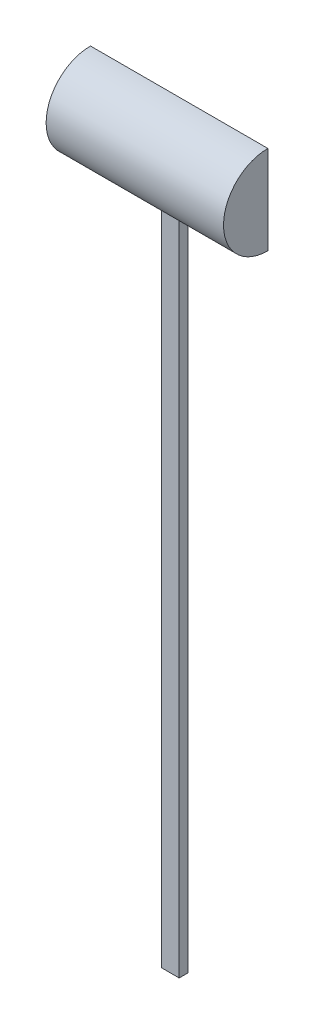
ISO-10303-21;
HEADER;
FILE_DESCRIPTION(('STEP AP214'),'2;1');
FILE_NAME('part.step','',(''),(''),'','','');
FILE_SCHEMA(('AUTOMOTIVE_DESIGN { 1 0 10303 214 1 1 1 1 }'));
ENDSEC;
DATA;
#1=APPLICATION_CONTEXT('core data for automotive mechanical design processes');
#2=APPLICATION_PROTOCOL_DEFINITION('international standard','automotive_design',2000,#1);
#3=PRODUCT_CONTEXT('',#1,'mechanical');
#4=PRODUCT('Part','Part','',(#3));
#5=PRODUCT_RELATED_PRODUCT_CATEGORY('part','',(#4));
#6=PRODUCT_DEFINITION_FORMATION('','',#4);
#7=PRODUCT_DEFINITION_CONTEXT('part definition',#1,'design');
#8=PRODUCT_DEFINITION('design','',#6,#7);
#9=PRODUCT_DEFINITION_SHAPE('','',#8);
#10=(LENGTH_UNIT() NAMED_UNIT(*) SI_UNIT(.MILLI.,.METRE.));
#11=(NAMED_UNIT(*) PLANE_ANGLE_UNIT() SI_UNIT($,.RADIAN.));
#12=(NAMED_UNIT(*) SI_UNIT($,.STERADIAN.) SOLID_ANGLE_UNIT());
#13=UNCERTAINTY_MEASURE_WITH_UNIT(LENGTH_MEASURE(1.E-05),#10,'distance_accuracy_value','');
#14=(GEOMETRIC_REPRESENTATION_CONTEXT(3) GLOBAL_UNCERTAINTY_ASSIGNED_CONTEXT((#13)) GLOBAL_UNIT_ASSIGNED_CONTEXT((#10,
#11,#12)) REPRESENTATION_CONTEXT('',''));
#15=CARTESIAN_POINT('',(0.,0.,0.));
#16=DIRECTION('',(0.,0.,1.));
#17=DIRECTION('',(1.,0.,0.));
#18=AXIS2_PLACEMENT_3D('',#15,#16,#17);
#19=CARTESIAN_POINT('',(0.,0.,0.));
#20=DIRECTION('',(0.,0.,1.));
#21=DIRECTION('',(1.,0.,0.));
#22=AXIS2_PLACEMENT_3D('',#19,#20,#21);
#23=PLANE('',#22);
#24=DIRECTION('',(0.,-1.,0.));
#25=VECTOR('',#24,1.);
#26=CARTESIAN_POINT('',(10.,0.,0.));
#27=LINE('',#26,#25);
#28=CARTESIAN_POINT('',(10.,5.,0.));
#29=VERTEX_POINT('',#28);
#30=CARTESIAN_POINT('',(10.,-5.,0.));
#31=VERTEX_POINT('',#30);
#32=EDGE_CURVE('E11',#29,#31,#27,.T.);
#33=ORIENTED_EDGE('',*,*,#32,.T.);
#34=DIRECTION('',(-1.,0.,0.));
#35=VECTOR('',#34,1.);
#36=CARTESIAN_POINT('',(10.,-5.,0.));
#37=LINE('',#36,#35);
#38=CARTESIAN_POINT('',(1.,-5.,0.));
#39=VERTEX_POINT('',#38);
#40=EDGE_CURVE('E52',#39,#31,#37,.F.);
#41=ORIENTED_EDGE('',*,*,#40,.F.);
#42=DIRECTION('',(0.,1.,0.));
#43=VECTOR('',#42,1.);
#44=CARTESIAN_POINT('',(1.,0.,0.));
#45=LINE('',#44,#43);
#46=CARTESIAN_POINT('',(1.00000000000002,-80.,0.));
#47=VERTEX_POINT('',#46);
#48=EDGE_CURVE('E124',#47,#39,#45,.T.);
#49=ORIENTED_EDGE('',*,*,#48,.F.);
#50=DIRECTION('',(1.,0.,0.));
#51=VECTOR('',#50,1.);
#52=CARTESIAN_POINT('',(-0.99999999999999,-80.,0.));
#53=LINE('',#52,#51);
#54=CARTESIAN_POINT('',(-0.99999999999999,-80.,0.));
#55=VERTEX_POINT('',#54);
#56=EDGE_CURVE('E126',#55,#47,#53,.T.);
#57=ORIENTED_EDGE('',*,*,#56,.F.);
#58=DIRECTION('',(0.,-1.,0.));
#59=VECTOR('',#58,1.);
#60=CARTESIAN_POINT('',(-1.,0.,0.));
#61=LINE('',#60,#59);
#62=CARTESIAN_POINT('',(-0.999999999999999,-5.,0.));
#63=VERTEX_POINT('',#62);
#64=EDGE_CURVE('E107',#63,#55,#61,.T.);
#65=ORIENTED_EDGE('',*,*,#64,.F.);
#66=CARTESIAN_POINT('',(-10.,-5.,0.));
#67=VERTEX_POINT('',#66);
#68=EDGE_CURVE('E130',#67,#63,#37,.F.);
#69=ORIENTED_EDGE('',*,*,#68,.F.);
#70=DIRECTION('',(0.,-1.,0.));
#71=VECTOR('',#70,1.);
#72=CARTESIAN_POINT('',(-10.,0.,0.));
#73=LINE('',#72,#71);
#74=CARTESIAN_POINT('',(-10.,5.,0.));
#75=VERTEX_POINT('',#74);
#76=EDGE_CURVE('E129',#75,#67,#73,.T.);
#77=ORIENTED_EDGE('',*,*,#76,.F.);
#78=DIRECTION('',(-1.,0.,0.));
#79=VECTOR('',#78,1.);
#80=CARTESIAN_POINT('',(10.,5.,0.));
#81=LINE('',#80,#79);
#82=EDGE_CURVE('E35',#29,#75,#81,.T.);
#83=ORIENTED_EDGE('',*,*,#82,.F.);
#84=EDGE_LOOP('',(#33,#41,#49,#57,#65,#69,#77,#83));
#85=FACE_BOUND('',#84,.T.);
#86=ADVANCED_FACE('F32',(#85),#23,.F.);
#87=CARTESIAN_POINT('',(-1.,0.,1.));
#88=DIRECTION('',(1.,0.,0.));
#89=DIRECTION('',(0.,1.,0.));
#90=AXIS2_PLACEMENT_3D('',#87,#88,#89);
#91=PLANE('',#90);
#92=CARTESIAN_POINT('',(-0.999999999999999,0.,0.));
#93=DIRECTION('',(1.,0.,0.));
#94=DIRECTION('',(0.,1.,0.));
#95=AXIS2_PLACEMENT_3D('',#92,#93,#94);
#96=CIRCLE('',#95,5.);
#97=CARTESIAN_POINT('',(-0.999999999999999,-4.89897948556635,1.));
#98=VERTEX_POINT('',#97);
#99=EDGE_CURVE('E121',#98,#63,#96,.T.);
#100=ORIENTED_EDGE('',*,*,#99,.T.);
#101=ORIENTED_EDGE('',*,*,#64,.T.);
#102=DIRECTION('',(0.,0.,-1.));
#103=VECTOR('',#102,1.);
#104=CARTESIAN_POINT('',(-0.99999999999999,-80.,1.));
#105=LINE('',#104,#103);
#106=CARTESIAN_POINT('',(-0.99999999999999,-80.,1.));
#107=VERTEX_POINT('',#106);
#108=EDGE_CURVE('E99',#107,#55,#105,.T.);
#109=ORIENTED_EDGE('',*,*,#108,.F.);
#110=DIRECTION('',(0.,-1.,0.));
#111=VECTOR('',#110,1.);
#112=CARTESIAN_POINT('',(-1.,0.,1.));
#113=LINE('',#112,#111);
#114=EDGE_CURVE('E84',#98,#107,#113,.T.);
#115=ORIENTED_EDGE('',*,*,#114,.F.);
#116=EDGE_LOOP('',(#100,#101,#109,#115));
#117=FACE_BOUND('',#116,.T.);
#118=ADVANCED_FACE('F105',(#117),#91,.F.);
#119=CARTESIAN_POINT('',(0.,0.,1.));
#120=DIRECTION('',(0.,0.,1.));
#121=DIRECTION('',(1.,0.,0.));
#122=AXIS2_PLACEMENT_3D('',#119,#120,#121);
#123=PLANE('',#122);
#124=DIRECTION('',(-1.,0.,0.));
#125=VECTOR('',#124,1.);
#126=CARTESIAN_POINT('',(10.,-4.89897948556635,1.));
#127=LINE('',#126,#125);
#128=CARTESIAN_POINT('',(1.,-4.89897948556635,1.));
#129=VERTEX_POINT('',#128);
#130=EDGE_CURVE('E91',#98,#129,#127,.F.);
#131=ORIENTED_EDGE('',*,*,#130,.F.);
#132=ORIENTED_EDGE('',*,*,#114,.T.);
#133=DIRECTION('',(1.,0.,0.));
#134=VECTOR('',#133,1.);
#135=CARTESIAN_POINT('',(-0.99999999999999,-80.,1.));
#136=LINE('',#135,#134);
#137=CARTESIAN_POINT('',(1.00000000000002,-80.,1.));
#138=VERTEX_POINT('',#137);
#139=EDGE_CURVE('E88',#107,#138,#136,.T.);
#140=ORIENTED_EDGE('',*,*,#139,.T.);
#141=DIRECTION('',(0.,1.,0.));
#142=VECTOR('',#141,1.);
#143=CARTESIAN_POINT('',(1.,0.,1.));
#144=LINE('',#143,#142);
#145=EDGE_CURVE('E103',#138,#129,#144,.T.);
#146=ORIENTED_EDGE('',*,*,#145,.T.);
#147=EDGE_LOOP('',(#131,#132,#140,#146));
#148=FACE_BOUND('',#147,.T.);
#149=ADVANCED_FACE('F86',(#148),#123,.T.);
#150=CARTESIAN_POINT('',(10.,0.,0.));
#151=DIRECTION('',(-1.,0.,0.));
#152=DIRECTION('',(0.,0.,1.));
#153=AXIS2_PLACEMENT_3D('',#150,#151,#152);
#154=CYLINDRICAL_SURFACE('',#153,5.);
#155=CARTESIAN_POINT('',(10.,0.,0.));
#156=DIRECTION('',(1.,0.,0.));
#157=DIRECTION('',(0.,0.,-1.));
#158=AXIS2_PLACEMENT_3D('',#155,#156,#157);
#159=CIRCLE('',#158,5.);
#160=EDGE_CURVE('E112',#29,#31,#159,.T.);
#161=ORIENTED_EDGE('',*,*,#160,.F.);
#162=ORIENTED_EDGE('',*,*,#82,.T.);
#163=CARTESIAN_POINT('',(-10.,0.,0.));
#164=DIRECTION('',(1.,0.,0.));
#165=DIRECTION('',(0.,0.,-1.));
#166=AXIS2_PLACEMENT_3D('',#163,#164,#165);
#167=CIRCLE('',#166,5.);
#168=EDGE_CURVE('E109',#75,#67,#167,.T.);
#169=ORIENTED_EDGE('',*,*,#168,.T.);
#170=ORIENTED_EDGE('',*,*,#68,.T.);
#171=ORIENTED_EDGE('',*,*,#99,.F.);
#172=ORIENTED_EDGE('',*,*,#130,.T.);
#173=CARTESIAN_POINT('',(0.999999999999999,0.,0.));
#174=DIRECTION('',(-1.,0.,0.));
#175=DIRECTION('',(0.,-1.,0.));
#176=AXIS2_PLACEMENT_3D('',#173,#174,#175);
#177=CIRCLE('',#176,5.);
#178=EDGE_CURVE('E118',#39,#129,#177,.T.);
#179=ORIENTED_EDGE('',*,*,#178,.F.);
#180=ORIENTED_EDGE('',*,*,#40,.T.);
#181=EDGE_LOOP('',(#161,#162,#169,#170,#171,#172,#179,#180));
#182=FACE_BOUND('',#181,.T.);
#183=ADVANCED_FACE('F136',(#182),#154,.T.);
#184=CARTESIAN_POINT('',(-0.99999999999999,-80.,1.));
#185=DIRECTION('',(0.,1.,0.));
#186=DIRECTION('',(0.,0.,1.));
#187=AXIS2_PLACEMENT_3D('',#184,#185,#186);
#188=PLANE('',#187);
#189=ORIENTED_EDGE('',*,*,#108,.T.);
#190=ORIENTED_EDGE('',*,*,#56,.T.);
#191=DIRECTION('',(0.,0.,-1.));
#192=VECTOR('',#191,1.);
#193=CARTESIAN_POINT('',(1.00000000000002,-80.,1.));
#194=LINE('',#193,#192);
#195=EDGE_CURVE('E101',#138,#47,#194,.T.);
#196=ORIENTED_EDGE('',*,*,#195,.F.);
#197=ORIENTED_EDGE('',*,*,#139,.F.);
#198=EDGE_LOOP('',(#189,#190,#196,#197));
#199=FACE_BOUND('',#198,.T.);
#200=ADVANCED_FACE('F98',(#199),#188,.F.);
#201=CARTESIAN_POINT('',(1.,0.,1.));
#202=DIRECTION('',(-1.,0.,0.));
#203=DIRECTION('',(0.,-1.,0.));
#204=AXIS2_PLACEMENT_3D('',#201,#202,#203);
#205=PLANE('',#204);
#206=ORIENTED_EDGE('',*,*,#195,.T.);
#207=ORIENTED_EDGE('',*,*,#48,.T.);
#208=ORIENTED_EDGE('',*,*,#178,.T.);
#209=ORIENTED_EDGE('',*,*,#145,.F.);
#210=EDGE_LOOP('',(#206,#207,#208,#209));
#211=FACE_BOUND('',#210,.T.);
#212=ADVANCED_FACE('F141',(#211),#205,.F.);
#213=CARTESIAN_POINT('',(-10.,0.,0.));
#214=DIRECTION('',(1.,0.,0.));
#215=DIRECTION('',(0.,0.,-1.));
#216=AXIS2_PLACEMENT_3D('',#213,#214,#215);
#217=PLANE('',#216);
#218=ORIENTED_EDGE('',*,*,#168,.F.);
#219=ORIENTED_EDGE('',*,*,#76,.T.);
#220=EDGE_LOOP('',(#218,#219));
#221=FACE_BOUND('',#220,.T.);
#222=ADVANCED_FACE('F135',(#221),#217,.F.);
#223=CARTESIAN_POINT('',(10.,0.,0.));
#224=DIRECTION('',(1.,0.,0.));
#225=DIRECTION('',(0.,0.,-1.));
#226=AXIS2_PLACEMENT_3D('',#223,#224,#225);
#227=PLANE('',#226);
#228=ORIENTED_EDGE('',*,*,#32,.F.);
#229=ORIENTED_EDGE('',*,*,#160,.T.);
#230=EDGE_LOOP('',(#228,#229));
#231=FACE_BOUND('',#230,.T.);
#232=ADVANCED_FACE('F138',(#231),#227,.T.);
#233=CLOSED_SHELL('',(#86,#118,#149,#183,#200,#212,#222,#232));
#234=MANIFOLD_SOLID_BREP('B2',#233);
#235=ADVANCED_BREP_SHAPE_REPRESENTATION('',(#18,#234),#14);
#236=SHAPE_DEFINITION_REPRESENTATION(#9,#235);
ENDSEC;
END-ISO-10303-21;
